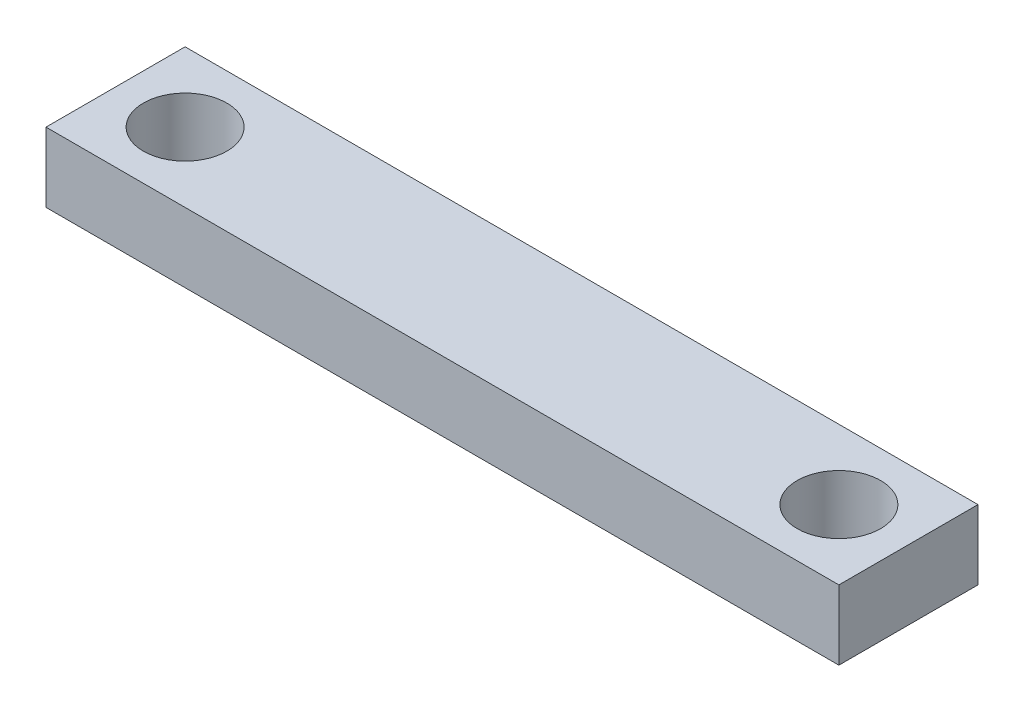
ISO-10303-21;
HEADER;
FILE_DESCRIPTION(('STEP AP214'),'2;1');
FILE_NAME('part.step','',(''),(''),'','','');
FILE_SCHEMA(('AUTOMOTIVE_DESIGN { 1 0 10303 214 1 1 1 1 }'));
ENDSEC;
DATA;
#1=APPLICATION_CONTEXT('core data for automotive mechanical design processes');
#2=APPLICATION_PROTOCOL_DEFINITION('international standard','automotive_design',2000,#1);
#3=PRODUCT_CONTEXT('',#1,'mechanical');
#4=PRODUCT('Part','Part','',(#3));
#5=PRODUCT_RELATED_PRODUCT_CATEGORY('part','',(#4));
#6=PRODUCT_DEFINITION_FORMATION('','',#4);
#7=PRODUCT_DEFINITION_CONTEXT('part definition',#1,'design');
#8=PRODUCT_DEFINITION('design','',#6,#7);
#9=PRODUCT_DEFINITION_SHAPE('','',#8);
#10=(LENGTH_UNIT() NAMED_UNIT(*) SI_UNIT(.MILLI.,.METRE.));
#11=(NAMED_UNIT(*) PLANE_ANGLE_UNIT() SI_UNIT($,.RADIAN.));
#12=(NAMED_UNIT(*) SI_UNIT($,.STERADIAN.) SOLID_ANGLE_UNIT());
#13=UNCERTAINTY_MEASURE_WITH_UNIT(LENGTH_MEASURE(1.E-05),#10,'distance_accuracy_value','');
#14=(GEOMETRIC_REPRESENTATION_CONTEXT(3) GLOBAL_UNCERTAINTY_ASSIGNED_CONTEXT((#13)) GLOBAL_UNIT_ASSIGNED_CONTEXT((#10,
#11,#12)) REPRESENTATION_CONTEXT('',''));
#15=CARTESIAN_POINT('',(0.,0.,0.));
#16=DIRECTION('',(0.,0.,1.));
#17=DIRECTION('',(1.,0.,0.));
#18=AXIS2_PLACEMENT_3D('',#15,#16,#17);
#19=CARTESIAN_POINT('',(0.,2.5,0.));
#20=DIRECTION('',(0.,-1.,0.));
#21=DIRECTION('',(0.,0.,-1.));
#22=AXIS2_PLACEMENT_3D('',#19,#20,#21);
#23=PLANE('',#22);
#24=DIRECTION('',(0.,0.,1.));
#25=VECTOR('',#24,1.);
#26=CARTESIAN_POINT('',(-28.5,2.5,-4.99999999999999));
#27=LINE('',#26,#25);
#28=CARTESIAN_POINT('',(-28.5,2.5,-4.99999999999999));
#29=VERTEX_POINT('',#28);
#30=CARTESIAN_POINT('',(-28.5,2.5,5.00000000000001));
#31=VERTEX_POINT('',#30);
#32=EDGE_CURVE('E85',#29,#31,#27,.T.);
#33=ORIENTED_EDGE('',*,*,#32,.T.);
#34=DIRECTION('',(1.,0.,0.));
#35=VECTOR('',#34,1.);
#36=CARTESIAN_POINT('',(28.5,2.5,5.));
#37=LINE('',#36,#35);
#38=CARTESIAN_POINT('',(28.5,2.5,5.));
#39=VERTEX_POINT('',#38);
#40=EDGE_CURVE('E80',#31,#39,#37,.T.);
#41=ORIENTED_EDGE('',*,*,#40,.T.);
#42=DIRECTION('',(0.,0.,-1.));
#43=VECTOR('',#42,1.);
#44=CARTESIAN_POINT('',(28.5,2.5,-5.));
#45=LINE('',#44,#43);
#46=CARTESIAN_POINT('',(28.5,2.5,-5.));
#47=VERTEX_POINT('',#46);
#48=EDGE_CURVE('E83',#39,#47,#45,.T.);
#49=ORIENTED_EDGE('',*,*,#48,.T.);
#50=DIRECTION('',(-1.,0.,0.));
#51=VECTOR('',#50,1.);
#52=CARTESIAN_POINT('',(28.5,2.5,-5.));
#53=LINE('',#52,#51);
#54=EDGE_CURVE('E50',#47,#29,#53,.T.);
#55=ORIENTED_EDGE('',*,*,#54,.T.);
#56=EDGE_LOOP('',(#33,#41,#49,#55));
#57=FACE_BOUND('',#56,.T.);
#58=CARTESIAN_POINT('',(-23.5,2.5,0.));
#59=DIRECTION('',(0.,1.,0.));
#60=DIRECTION('',(0.,0.,1.));
#61=AXIS2_PLACEMENT_3D('',#58,#59,#60);
#62=CIRCLE('',#61,2.99999999999999);
#63=CARTESIAN_POINT('',(-23.5,2.5,2.99999999999999));
#64=VERTEX_POINT('',#63);
#65=EDGE_CURVE('E100',#64,#64,#62,.T.);
#66=ORIENTED_EDGE('',*,*,#65,.F.);
#67=EDGE_LOOP('',(#66));
#68=FACE_BOUND('',#67,.T.);
#69=CARTESIAN_POINT('',(23.5,2.5,0.));
#70=DIRECTION('',(0.,1.,0.));
#71=DIRECTION('',(0.,0.,1.));
#72=AXIS2_PLACEMENT_3D('',#69,#70,#71);
#73=CIRCLE('',#72,2.99999999999999);
#74=CARTESIAN_POINT('',(23.5,2.5,2.99999999999999));
#75=VERTEX_POINT('',#74);
#76=EDGE_CURVE('E115',#75,#75,#73,.T.);
#77=ORIENTED_EDGE('',*,*,#76,.F.);
#78=EDGE_LOOP('',(#77));
#79=FACE_BOUND('',#78,.T.);
#80=ADVANCED_FACE('F33',(#57,#68,#79),#23,.F.);
#81=CARTESIAN_POINT('',(0.,-2.5,0.));
#82=DIRECTION('',(0.,-1.,0.));
#83=DIRECTION('',(0.,0.,-1.));
#84=AXIS2_PLACEMENT_3D('',#81,#82,#83);
#85=PLANE('',#84);
#86=CARTESIAN_POINT('',(-23.5,-2.5,0.));
#87=DIRECTION('',(0.,1.,0.));
#88=DIRECTION('',(0.,0.,1.));
#89=AXIS2_PLACEMENT_3D('',#86,#87,#88);
#90=CIRCLE('',#89,2.99999999999999);
#91=CARTESIAN_POINT('',(-23.5,-2.5,2.99999999999999));
#92=VERTEX_POINT('',#91);
#93=EDGE_CURVE('E112',#92,#92,#90,.T.);
#94=ORIENTED_EDGE('',*,*,#93,.T.);
#95=EDGE_LOOP('',(#94));
#96=FACE_BOUND('',#95,.T.);
#97=DIRECTION('',(0.,0.,1.));
#98=VECTOR('',#97,1.);
#99=CARTESIAN_POINT('',(-28.5,-2.5,-4.99999999999999));
#100=LINE('',#99,#98);
#101=CARTESIAN_POINT('',(-28.5,-2.5,-4.99999999999999));
#102=VERTEX_POINT('',#101);
#103=CARTESIAN_POINT('',(-28.5,-2.5,5.00000000000001));
#104=VERTEX_POINT('',#103);
#105=EDGE_CURVE('E97',#102,#104,#100,.T.);
#106=ORIENTED_EDGE('',*,*,#105,.F.);
#107=DIRECTION('',(-1.,0.,0.));
#108=VECTOR('',#107,1.);
#109=CARTESIAN_POINT('',(28.5,-2.5,-5.));
#110=LINE('',#109,#108);
#111=CARTESIAN_POINT('',(28.5,-2.5,-5.));
#112=VERTEX_POINT('',#111);
#113=EDGE_CURVE('E73',#112,#102,#110,.T.);
#114=ORIENTED_EDGE('',*,*,#113,.F.);
#115=DIRECTION('',(0.,0.,-1.));
#116=VECTOR('',#115,1.);
#117=CARTESIAN_POINT('',(28.5,-2.5,-5.));
#118=LINE('',#117,#116);
#119=CARTESIAN_POINT('',(28.5,-2.5,5.));
#120=VERTEX_POINT('',#119);
#121=EDGE_CURVE('E67',#120,#112,#118,.T.);
#122=ORIENTED_EDGE('',*,*,#121,.F.);
#123=DIRECTION('',(1.,0.,0.));
#124=VECTOR('',#123,1.);
#125=CARTESIAN_POINT('',(28.5,-2.5,5.));
#126=LINE('',#125,#124);
#127=EDGE_CURVE('E89',#104,#120,#126,.T.);
#128=ORIENTED_EDGE('',*,*,#127,.F.);
#129=EDGE_LOOP('',(#106,#114,#122,#128));
#130=FACE_BOUND('',#129,.T.);
#131=CARTESIAN_POINT('',(23.5,-2.5,0.));
#132=DIRECTION('',(0.,1.,0.));
#133=DIRECTION('',(0.,0.,1.));
#134=AXIS2_PLACEMENT_3D('',#131,#132,#133);
#135=CIRCLE('',#134,2.99999999999999);
#136=CARTESIAN_POINT('',(23.5,-2.5,2.99999999999999));
#137=VERTEX_POINT('',#136);
#138=EDGE_CURVE('E118',#137,#137,#135,.T.);
#139=ORIENTED_EDGE('',*,*,#138,.T.);
#140=EDGE_LOOP('',(#139));
#141=FACE_BOUND('',#140,.T.);
#142=ADVANCED_FACE('F108',(#96,#130,#141),#85,.T.);
#143=CARTESIAN_POINT('',(-28.5,2.5,-4.99999999999999));
#144=DIRECTION('',(1.,0.,0.));
#145=DIRECTION('',(0.,0.,-1.));
#146=AXIS2_PLACEMENT_3D('',#143,#144,#145);
#147=PLANE('',#146);
#148=ORIENTED_EDGE('',*,*,#105,.T.);
#149=DIRECTION('',(0.,-1.,0.));
#150=VECTOR('',#149,1.);
#151=CARTESIAN_POINT('',(-28.5,2.5,5.00000000000001));
#152=LINE('',#151,#150);
#153=EDGE_CURVE('E11',#31,#104,#152,.T.);
#154=ORIENTED_EDGE('',*,*,#153,.F.);
#155=ORIENTED_EDGE('',*,*,#32,.F.);
#156=DIRECTION('',(0.,-1.,0.));
#157=VECTOR('',#156,1.);
#158=CARTESIAN_POINT('',(-28.5,2.5,-4.99999999999999));
#159=LINE('',#158,#157);
#160=EDGE_CURVE('E93',#29,#102,#159,.T.);
#161=ORIENTED_EDGE('',*,*,#160,.T.);
#162=EDGE_LOOP('',(#148,#154,#155,#161));
#163=FACE_BOUND('',#162,.T.);
#164=ADVANCED_FACE('F35',(#163),#147,.F.);
#165=CARTESIAN_POINT('',(28.5,2.5,5.));
#166=DIRECTION('',(0.,0.,-1.));
#167=DIRECTION('',(-1.,0.,0.));
#168=AXIS2_PLACEMENT_3D('',#165,#166,#167);
#169=PLANE('',#168);
#170=ORIENTED_EDGE('',*,*,#127,.T.);
#171=DIRECTION('',(0.,-1.,0.));
#172=VECTOR('',#171,1.);
#173=CARTESIAN_POINT('',(28.5,2.5,5.));
#174=LINE('',#173,#172);
#175=EDGE_CURVE('E42',#39,#120,#174,.T.);
#176=ORIENTED_EDGE('',*,*,#175,.F.);
#177=ORIENTED_EDGE('',*,*,#40,.F.);
#178=ORIENTED_EDGE('',*,*,#153,.T.);
#179=EDGE_LOOP('',(#170,#176,#177,#178));
#180=FACE_BOUND('',#179,.T.);
#181=ADVANCED_FACE('F88',(#180),#169,.F.);
#182=CARTESIAN_POINT('',(28.5,2.5,-5.));
#183=DIRECTION('',(-1.,0.,0.));
#184=DIRECTION('',(0.,0.,1.));
#185=AXIS2_PLACEMENT_3D('',#182,#183,#184);
#186=PLANE('',#185);
#187=ORIENTED_EDGE('',*,*,#121,.T.);
#188=DIRECTION('',(0.,-1.,0.));
#189=VECTOR('',#188,1.);
#190=CARTESIAN_POINT('',(28.5,2.5,-5.));
#191=LINE('',#190,#189);
#192=EDGE_CURVE('E90',#47,#112,#191,.T.);
#193=ORIENTED_EDGE('',*,*,#192,.F.);
#194=ORIENTED_EDGE('',*,*,#48,.F.);
#195=ORIENTED_EDGE('',*,*,#175,.T.);
#196=EDGE_LOOP('',(#187,#193,#194,#195));
#197=FACE_BOUND('',#196,.T.);
#198=ADVANCED_FACE('F91',(#197),#186,.F.);
#199=CARTESIAN_POINT('',(28.5,2.5,-5.));
#200=DIRECTION('',(0.,0.,1.));
#201=DIRECTION('',(1.,0.,0.));
#202=AXIS2_PLACEMENT_3D('',#199,#200,#201);
#203=PLANE('',#202);
#204=ORIENTED_EDGE('',*,*,#113,.T.);
#205=ORIENTED_EDGE('',*,*,#160,.F.);
#206=ORIENTED_EDGE('',*,*,#54,.F.);
#207=ORIENTED_EDGE('',*,*,#192,.T.);
#208=EDGE_LOOP('',(#204,#205,#206,#207));
#209=FACE_BOUND('',#208,.T.);
#210=ADVANCED_FACE('F105',(#209),#203,.F.);
#211=CARTESIAN_POINT('',(-23.5,2.5,0.));
#212=DIRECTION('',(0.,-1.,0.));
#213=DIRECTION('',(0.,0.,-1.));
#214=AXIS2_PLACEMENT_3D('',#211,#212,#213);
#215=CYLINDRICAL_SURFACE('',#214,2.99999999999999);
#216=ORIENTED_EDGE('',*,*,#65,.T.);
#217=EDGE_LOOP('',(#216));
#218=FACE_BOUND('',#217,.T.);
#219=ORIENTED_EDGE('',*,*,#93,.F.);
#220=EDGE_LOOP('',(#219));
#221=FACE_BOUND('',#220,.T.);
#222=ADVANCED_FACE('F135',(#218,#221),#215,.F.);
#223=CARTESIAN_POINT('',(23.5,2.5,0.));
#224=DIRECTION('',(0.,-1.,0.));
#225=DIRECTION('',(0.,0.,-1.));
#226=AXIS2_PLACEMENT_3D('',#223,#224,#225);
#227=CYLINDRICAL_SURFACE('',#226,2.99999999999999);
#228=ORIENTED_EDGE('',*,*,#76,.T.);
#229=EDGE_LOOP('',(#228));
#230=FACE_BOUND('',#229,.T.);
#231=ORIENTED_EDGE('',*,*,#138,.F.);
#232=EDGE_LOOP('',(#231));
#233=FACE_BOUND('',#232,.T.);
#234=ADVANCED_FACE('F124',(#230,#233),#227,.F.);
#235=CLOSED_SHELL('',(#80,#142,#164,#181,#198,#210,#222,#234));
#236=MANIFOLD_SOLID_BREP('B2',#235);
#237=ADVANCED_BREP_SHAPE_REPRESENTATION('',(#18,#236),#14);
#238=SHAPE_DEFINITION_REPRESENTATION(#9,#237);
ENDSEC;
END-ISO-10303-21;
